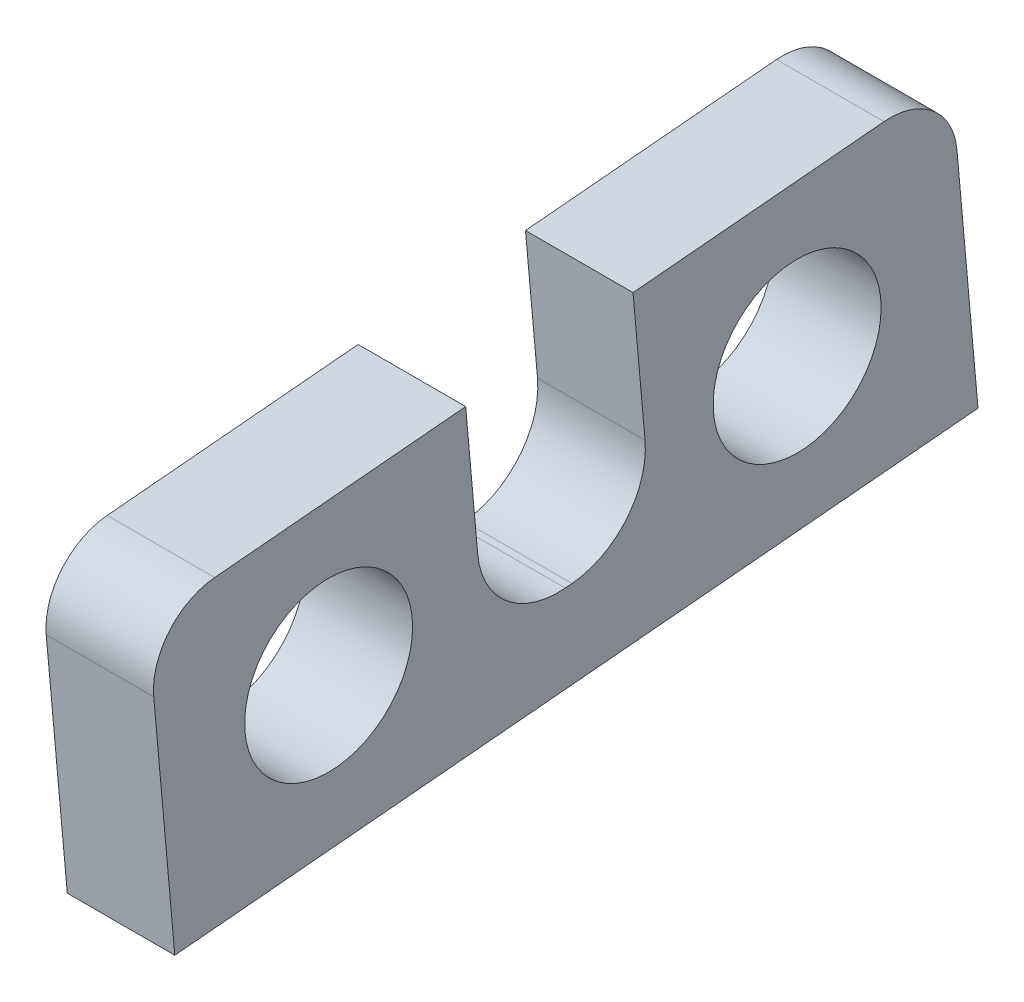
ISO-10303-21;
HEADER;
FILE_DESCRIPTION(('STEP AP214'),'2;1');
FILE_NAME('part.step','',(''),(''),'','','');
FILE_SCHEMA(('AUTOMOTIVE_DESIGN { 1 0 10303 214 1 1 1 1 }'));
ENDSEC;
DATA;
#1=APPLICATION_CONTEXT('core data for automotive mechanical design processes');
#2=APPLICATION_PROTOCOL_DEFINITION('international standard','automotive_design',2000,#1);
#3=PRODUCT_CONTEXT('',#1,'mechanical');
#4=PRODUCT('Part','Part','',(#3));
#5=PRODUCT_RELATED_PRODUCT_CATEGORY('part','',(#4));
#6=PRODUCT_DEFINITION_FORMATION('','',#4);
#7=PRODUCT_DEFINITION_CONTEXT('part definition',#1,'design');
#8=PRODUCT_DEFINITION('design','',#6,#7);
#9=PRODUCT_DEFINITION_SHAPE('','',#8);
#10=(LENGTH_UNIT() NAMED_UNIT(*) SI_UNIT(.MILLI.,.METRE.));
#11=(NAMED_UNIT(*) PLANE_ANGLE_UNIT() SI_UNIT($,.RADIAN.));
#12=(NAMED_UNIT(*) SI_UNIT($,.STERADIAN.) SOLID_ANGLE_UNIT());
#13=UNCERTAINTY_MEASURE_WITH_UNIT(LENGTH_MEASURE(1.E-05),#10,'distance_accuracy_value','');
#14=(GEOMETRIC_REPRESENTATION_CONTEXT(3) GLOBAL_UNCERTAINTY_ASSIGNED_CONTEXT((#13)) GLOBAL_UNIT_ASSIGNED_CONTEXT((#10,
#11,#12)) REPRESENTATION_CONTEXT('',''));
#15=CARTESIAN_POINT('',(0.,0.,0.));
#16=DIRECTION('',(0.,0.,1.));
#17=DIRECTION('',(1.,0.,0.));
#18=AXIS2_PLACEMENT_3D('',#15,#16,#17);
#19=CARTESIAN_POINT('',(1.6,32.7650006035263,-1.71816877408288));
#20=DIRECTION('',(1.,0.,0.));
#21=DIRECTION('',(0.,0.,-1.));
#22=AXIS2_PLACEMENT_3D('',#19,#20,#21);
#23=PLANE('',#22);
#24=CARTESIAN_POINT('',(1.6,30.759584164468,6.63592033879625));
#25=DIRECTION('',(1.,0.,0.));
#26=DIRECTION('',(0.,0.,-1.));
#27=AXIS2_PLACEMENT_3D('',#24,#25,#26);
#28=CIRCLE('',#27,1.25);
#29=CARTESIAN_POINT('',(1.6,30.759584164468,5.38592033879625));
#30=VERTEX_POINT('',#29);
#31=EDGE_CURVE('E174',#30,#30,#28,.T.);
#32=ORIENTED_EDGE('',*,*,#31,.F.);
#33=EDGE_LOOP('',(#32));
#34=FACE_BOUND('',#33,.T.);
#35=CARTESIAN_POINT('',(1.6,32.7650006035263,-1.71816877408288));
#36=DIRECTION('',(1.,0.,0.));
#37=DIRECTION('',(0.,0.,-1.));
#38=AXIS2_PLACEMENT_3D('',#35,#36,#37);
#39=CIRCLE('',#38,1.);
#40=CARTESIAN_POINT('',(1.6,32.854462799508,-2.71415899265439));
#41=VERTEX_POINT('',#40);
#42=CARTESIAN_POINT('',(1.6,33.7609908220978,-1.62870657810113));
#43=VERTEX_POINT('',#42);
#44=EDGE_CURVE('E204',#41,#43,#39,.T.);
#45=ORIENTED_EDGE('',*,*,#44,.T.);
#46=DIRECTION('',(0.,-0.0894621959817451,0.99599021857151));
#47=VECTOR('',#46,1.);
#48=CARTESIAN_POINT('',(1.6,33.4255075871663,2.10625674154203));
#49=LINE('',#48,#47);
#50=CARTESIAN_POINT('',(1.6,33.4255075871663,2.10625674154203));
#51=VERTEX_POINT('',#50);
#52=EDGE_CURVE('E114',#43,#51,#49,.T.);
#53=ORIENTED_EDGE('',*,*,#52,.T.);
#54=DIRECTION('',(0.,-0.99599021857151,-0.0894621959817466));
#55=VECTOR('',#54,1.);
#56=CARTESIAN_POINT('',(1.6,31.4335271500232,1.92733234957854));
#57=LINE('',#56,#55);
#58=CARTESIAN_POINT('',(1.6,31.4335271500232,1.92733234957854));
#59=VERTEX_POINT('',#58);
#60=EDGE_CURVE('E240',#51,#59,#57,.T.);
#61=ORIENTED_EDGE('',*,*,#60,.T.);
#62=CARTESIAN_POINT('',(1.6,31.3261725148451,3.12252061186435));
#63=DIRECTION('',(-1.,0.,0.));
#64=DIRECTION('',(0.,0.,-1.));
#65=AXIS2_PLACEMENT_3D('',#62,#63,#64);
#66=CIRCLE('',#65,1.2);
#67=CARTESIAN_POINT('',(1.6,30.1309842525593,3.01516597668625));
#68=VERTEX_POINT('',#67);
#69=EDGE_CURVE('E260',#59,#68,#66,.T.);
#70=ORIENTED_EDGE('',*,*,#69,.T.);
#71=DIRECTION('',(0.,-0.0894621959817545,0.995990218571509));
#72=VECTOR('',#71,1.);
#73=CARTESIAN_POINT('',(1.6,30.1220380329612,3.11476499854341));
#74=LINE('',#73,#72);
#75=CARTESIAN_POINT('',(1.6,30.1220380329612,3.11476499854341));
#76=VERTEX_POINT('',#75);
#77=EDGE_CURVE('E256',#68,#76,#74,.T.);
#78=ORIENTED_EDGE('',*,*,#77,.T.);
#79=CARTESIAN_POINT('',(1.6,31.317226295247,3.2221196337215));
#80=DIRECTION('',(-1.,0.,0.));
#81=DIRECTION('',(0.,0.,-1.));
#82=AXIS2_PLACEMENT_3D('',#79,#80,#81);
#83=CIRCLE('',#82,1.2);
#84=CARTESIAN_POINT('',(1.6,31.2098716600689,4.41730789600731));
#85=VERTEX_POINT('',#84);
#86=EDGE_CURVE('E259',#76,#85,#83,.T.);
#87=ORIENTED_EDGE('',*,*,#86,.T.);
#88=DIRECTION('',(0.,0.99599021857151,0.0894621959817469));
#89=VECTOR('',#88,1.);
#90=CARTESIAN_POINT('',(1.6,33.2018520972119,4.59623228797081));
#91=LINE('',#90,#89);
#92=CARTESIAN_POINT('',(1.6,33.2018520972119,4.59623228797081));
#93=VERTEX_POINT('',#92);
#94=EDGE_CURVE('E263',#85,#93,#91,.T.);
#95=ORIENTED_EDGE('',*,*,#94,.T.);
#96=DIRECTION('',(0.,-0.0894621959817451,0.99599021857151));
#97=VECTOR('',#96,1.);
#98=CARTESIAN_POINT('',(1.6,32.8663688622804,8.33119560761397));
#99=LINE('',#98,#97);
#100=CARTESIAN_POINT('',(1.6,32.8663688622804,8.33119560761397));
#101=VERTEX_POINT('',#100);
#102=EDGE_CURVE('E270',#93,#101,#99,.T.);
#103=ORIENTED_EDGE('',*,*,#102,.T.);
#104=CARTESIAN_POINT('',(1.6,31.8703786437088,8.24173341163222));
#105=DIRECTION('',(1.,0.,0.));
#106=DIRECTION('',(0.,0.,-1.));
#107=AXIS2_PLACEMENT_3D('',#104,#105,#106);
#108=CIRCLE('',#107,0.999999999999997);
#109=CARTESIAN_POINT('',(1.6,31.7809164477271,9.23772363020373));
#110=VERTEX_POINT('',#109);
#111=EDGE_CURVE('E145',#101,#110,#108,.T.);
#112=ORIENTED_EDGE('',*,*,#111,.T.);
#113=DIRECTION('',(0.,-0.99599021857147,-0.0894621959821926));
#114=VECTOR('',#113,1.);
#115=CARTESIAN_POINT('',(1.6,28.2949506827277,8.92460594426612));
#116=LINE('',#115,#114);
#117=CARTESIAN_POINT('',(1.6,28.2949506827277,8.92460594426612));
#118=VERTEX_POINT('',#117);
#119=EDGE_CURVE('E139',#110,#118,#116,.T.);
#120=ORIENTED_EDGE('',*,*,#119,.T.);
#121=DIRECTION('',(0.,0.0894621959817386,-0.99599021857151));
#122=VECTOR('',#121,1.);
#123=CARTESIAN_POINT('',(1.6,28.2949506827277,8.92460594426612));
#124=LINE('',#123,#122);
#125=CARTESIAN_POINT('',(1.6,29.3684970345086,-3.02727667859201));
#126=VERTEX_POINT('',#125);
#127=EDGE_CURVE('E143',#118,#126,#124,.T.);
#128=ORIENTED_EDGE('',*,*,#127,.T.);
#129=DIRECTION('',(0.,0.995990218571469,0.0894621959821941));
#130=VECTOR('',#129,1.);
#131=CARTESIAN_POINT('',(1.6,32.854462799508,-2.71415899265439));
#132=LINE('',#131,#130);
#133=EDGE_CURVE('E59',#126,#41,#132,.T.);
#134=ORIENTED_EDGE('',*,*,#133,.T.);
#135=EDGE_LOOP('',(#45,#53,#61,#70,#78,#87,#95,#103,#112,#120,#128,#134));
#136=FACE_BOUND('',#135,.T.);
#137=CARTESIAN_POINT('',(1.6,31.3858195363402,-0.33601119120432));
#138=DIRECTION('',(1.,0.,0.));
#139=DIRECTION('',(0.,0.,-1.));
#140=AXIS2_PLACEMENT_3D('',#137,#138,#139);
#141=CIRCLE('',#140,1.25);
#142=CARTESIAN_POINT('',(1.6,31.3858195363402,-1.58601119120432));
#143=VERTEX_POINT('',#142);
#144=EDGE_CURVE('E281',#143,#143,#141,.T.);
#145=ORIENTED_EDGE('',*,*,#144,.F.);
#146=EDGE_LOOP('',(#145));
#147=FACE_BOUND('',#146,.T.);
#148=ADVANCED_FACE('F41',(#34,#136,#147),#23,.T.);
#149=CARTESIAN_POINT('',(0.,32.7650006035263,-1.71816877408288));
#150=DIRECTION('',(1.,0.,0.));
#151=DIRECTION('',(0.,0.,-1.));
#152=AXIS2_PLACEMENT_3D('',#149,#150,#151);
#153=PLANE('',#152);
#154=CARTESIAN_POINT('',(0.,32.7650006035263,-1.71816877408288));
#155=DIRECTION('',(1.,0.,0.));
#156=DIRECTION('',(0.,0.,-1.));
#157=AXIS2_PLACEMENT_3D('',#154,#155,#156);
#158=CIRCLE('',#157,1.);
#159=CARTESIAN_POINT('',(0.,32.854462799508,-2.71415899265439));
#160=VERTEX_POINT('',#159);
#161=CARTESIAN_POINT('',(0.,33.7609908220978,-1.62870657810113));
#162=VERTEX_POINT('',#161);
#163=EDGE_CURVE('E169',#160,#162,#158,.T.);
#164=ORIENTED_EDGE('',*,*,#163,.F.);
#165=DIRECTION('',(0.,0.995990218571469,0.0894621959821941));
#166=VECTOR('',#165,1.);
#167=CARTESIAN_POINT('',(0.,32.854462799508,-2.71415899265439));
#168=LINE('',#167,#166);
#169=CARTESIAN_POINT('',(0.,29.3684970345086,-3.02727667859201));
#170=VERTEX_POINT('',#169);
#171=EDGE_CURVE('E106',#170,#160,#168,.T.);
#172=ORIENTED_EDGE('',*,*,#171,.F.);
#173=DIRECTION('',(0.,0.0894621959817386,-0.99599021857151));
#174=VECTOR('',#173,1.);
#175=CARTESIAN_POINT('',(0.,28.2949506827277,8.92460594426612));
#176=LINE('',#175,#174);
#177=CARTESIAN_POINT('',(0.,28.2949506827277,8.92460594426612));
#178=VERTEX_POINT('',#177);
#179=EDGE_CURVE('E100',#178,#170,#176,.T.);
#180=ORIENTED_EDGE('',*,*,#179,.F.);
#181=DIRECTION('',(0.,-0.99599021857147,-0.0894621959821926));
#182=VECTOR('',#181,1.);
#183=CARTESIAN_POINT('',(0.,28.2949506827277,8.92460594426612));
#184=LINE('',#183,#182);
#185=CARTESIAN_POINT('',(0.,31.7809164477271,9.23772363020373));
#186=VERTEX_POINT('',#185);
#187=EDGE_CURVE('E154',#186,#178,#184,.T.);
#188=ORIENTED_EDGE('',*,*,#187,.F.);
#189=CARTESIAN_POINT('',(0.,31.8703786437088,8.24173341163222));
#190=DIRECTION('',(1.,0.,0.));
#191=DIRECTION('',(0.,0.,-1.));
#192=AXIS2_PLACEMENT_3D('',#189,#190,#191);
#193=CIRCLE('',#192,0.999999999999997);
#194=CARTESIAN_POINT('',(0.,32.8663688622804,8.33119560761397));
#195=VERTEX_POINT('',#194);
#196=EDGE_CURVE('E195',#195,#186,#193,.T.);
#197=ORIENTED_EDGE('',*,*,#196,.F.);
#198=DIRECTION('',(0.,-0.0894621959817451,0.99599021857151));
#199=VECTOR('',#198,1.);
#200=CARTESIAN_POINT('',(0.,32.8663688622804,8.33119560761397));
#201=LINE('',#200,#199);
#202=CARTESIAN_POINT('',(0.,33.2018520972119,4.59623228797081));
#203=VERTEX_POINT('',#202);
#204=EDGE_CURVE('E192',#203,#195,#201,.T.);
#205=ORIENTED_EDGE('',*,*,#204,.F.);
#206=DIRECTION('',(0.,0.99599021857151,0.0894621959817469));
#207=VECTOR('',#206,1.);
#208=CARTESIAN_POINT('',(0.,33.2018520972119,4.59623228797081));
#209=LINE('',#208,#207);
#210=CARTESIAN_POINT('',(0.,31.2098716600689,4.41730789600731));
#211=VERTEX_POINT('',#210);
#212=EDGE_CURVE('E189',#211,#203,#209,.T.);
#213=ORIENTED_EDGE('',*,*,#212,.F.);
#214=CARTESIAN_POINT('',(0.,31.317226295247,3.2221196337215));
#215=DIRECTION('',(-1.,0.,0.));
#216=DIRECTION('',(0.,0.,-1.));
#217=AXIS2_PLACEMENT_3D('',#214,#215,#216);
#218=CIRCLE('',#217,1.2);
#219=CARTESIAN_POINT('',(0.,30.1220380329612,3.11476499854341));
#220=VERTEX_POINT('',#219);
#221=EDGE_CURVE('E186',#220,#211,#218,.T.);
#222=ORIENTED_EDGE('',*,*,#221,.F.);
#223=DIRECTION('',(0.,-0.0894621959817545,0.995990218571509));
#224=VECTOR('',#223,1.);
#225=CARTESIAN_POINT('',(0.,30.1220380329612,3.11476499854341));
#226=LINE('',#225,#224);
#227=CARTESIAN_POINT('',(0.,30.1309842525593,3.01516597668625));
#228=VERTEX_POINT('',#227);
#229=EDGE_CURVE('E183',#228,#220,#226,.T.);
#230=ORIENTED_EDGE('',*,*,#229,.F.);
#231=CARTESIAN_POINT('',(0.,31.3261725148451,3.12252061186435));
#232=DIRECTION('',(-1.,0.,0.));
#233=DIRECTION('',(0.,0.,-1.));
#234=AXIS2_PLACEMENT_3D('',#231,#232,#233);
#235=CIRCLE('',#234,1.2);
#236=CARTESIAN_POINT('',(0.,31.4335271500232,1.92733234957854));
#237=VERTEX_POINT('',#236);
#238=EDGE_CURVE('E180',#237,#228,#235,.T.);
#239=ORIENTED_EDGE('',*,*,#238,.F.);
#240=DIRECTION('',(0.,-0.99599021857151,-0.0894621959817466));
#241=VECTOR('',#240,1.);
#242=CARTESIAN_POINT('',(0.,31.4335271500232,1.92733234957854));
#243=LINE('',#242,#241);
#244=CARTESIAN_POINT('',(0.,33.4255075871663,2.10625674154203));
#245=VERTEX_POINT('',#244);
#246=EDGE_CURVE('E177',#245,#237,#243,.T.);
#247=ORIENTED_EDGE('',*,*,#246,.F.);
#248=DIRECTION('',(0.,-0.0894621959817451,0.99599021857151));
#249=VECTOR('',#248,1.);
#250=CARTESIAN_POINT('',(0.,33.4255075871663,2.10625674154203));
#251=LINE('',#250,#249);
#252=EDGE_CURVE('E173',#162,#245,#251,.T.);
#253=ORIENTED_EDGE('',*,*,#252,.F.);
#254=EDGE_LOOP('',(#164,#172,#180,#188,#197,#205,#213,#222,#230,#239,#247,#253));
#255=FACE_BOUND('',#254,.T.);
#256=CARTESIAN_POINT('',(0.,30.759584164468,6.63592033879625));
#257=DIRECTION('',(1.,0.,0.));
#258=DIRECTION('',(0.,0.,-1.));
#259=AXIS2_PLACEMENT_3D('',#256,#257,#258);
#260=CIRCLE('',#259,1.25);
#261=CARTESIAN_POINT('',(0.,30.759584164468,5.38592033879625));
#262=VERTEX_POINT('',#261);
#263=EDGE_CURVE('E275',#262,#262,#260,.T.);
#264=ORIENTED_EDGE('',*,*,#263,.T.);
#265=EDGE_LOOP('',(#264));
#266=FACE_BOUND('',#265,.T.);
#267=CARTESIAN_POINT('',(0.,31.3858195363402,-0.33601119120432));
#268=DIRECTION('',(1.,0.,0.));
#269=DIRECTION('',(0.,0.,-1.));
#270=AXIS2_PLACEMENT_3D('',#267,#268,#269);
#271=CIRCLE('',#270,1.25);
#272=CARTESIAN_POINT('',(0.,31.3858195363402,-1.58601119120432));
#273=VERTEX_POINT('',#272);
#274=EDGE_CURVE('E284',#273,#273,#271,.T.);
#275=ORIENTED_EDGE('',*,*,#274,.T.);
#276=EDGE_LOOP('',(#275));
#277=FACE_BOUND('',#276,.T.);
#278=ADVANCED_FACE('F244',(#255,#266,#277),#153,.F.);
#279=CARTESIAN_POINT('',(1.6,32.7650006035263,-1.71816877408288));
#280=DIRECTION('',(-1.,0.,0.));
#281=DIRECTION('',(0.,0.,1.));
#282=AXIS2_PLACEMENT_3D('',#279,#280,#281);
#283=CYLINDRICAL_SURFACE('',#282,1.);
#284=ORIENTED_EDGE('',*,*,#163,.T.);
#285=DIRECTION('',(-1.,0.,0.));
#286=VECTOR('',#285,1.);
#287=CARTESIAN_POINT('',(1.6,33.7609908220978,-1.62870657810113));
#288=LINE('',#287,#286);
#289=EDGE_CURVE('E11',#43,#162,#288,.T.);
#290=ORIENTED_EDGE('',*,*,#289,.F.);
#291=ORIENTED_EDGE('',*,*,#44,.F.);
#292=DIRECTION('',(-1.,0.,0.));
#293=VECTOR('',#292,1.);
#294=CARTESIAN_POINT('',(1.6,32.854462799508,-2.71415899265439));
#295=LINE('',#294,#293);
#296=EDGE_CURVE('E165',#41,#160,#295,.T.);
#297=ORIENTED_EDGE('',*,*,#296,.T.);
#298=EDGE_LOOP('',(#284,#290,#291,#297));
#299=FACE_BOUND('',#298,.T.);
#300=ADVANCED_FACE('F43',(#299),#283,.T.);
#301=CARTESIAN_POINT('',(1.6,33.4255075871663,2.10625674154203));
#302=DIRECTION('',(0.,-0.99599021857151,-0.0894621959817451));
#303=DIRECTION('',(0.,0.0894621959817451,-0.99599021857151));
#304=AXIS2_PLACEMENT_3D('',#301,#302,#303);
#305=PLANE('',#304);
#306=ORIENTED_EDGE('',*,*,#252,.T.);
#307=DIRECTION('',(-1.,0.,0.));
#308=VECTOR('',#307,1.);
#309=CARTESIAN_POINT('',(1.6,33.4255075871663,2.10625674154203));
#310=LINE('',#309,#308);
#311=EDGE_CURVE('E51',#51,#245,#310,.T.);
#312=ORIENTED_EDGE('',*,*,#311,.F.);
#313=ORIENTED_EDGE('',*,*,#52,.F.);
#314=ORIENTED_EDGE('',*,*,#289,.T.);
#315=EDGE_LOOP('',(#306,#312,#313,#314));
#316=FACE_BOUND('',#315,.T.);
#317=ADVANCED_FACE('F294',(#316),#305,.F.);
#318=CARTESIAN_POINT('',(1.6,31.4335271500232,1.92733234957854));
#319=DIRECTION('',(0.,0.0894621959817466,-0.99599021857151));
#320=DIRECTION('',(0.,0.99599021857151,0.0894621959817466));
#321=AXIS2_PLACEMENT_3D('',#318,#319,#320);
#322=PLANE('',#321);
#323=ORIENTED_EDGE('',*,*,#246,.T.);
#324=DIRECTION('',(-1.,0.,0.));
#325=VECTOR('',#324,1.);
#326=CARTESIAN_POINT('',(1.6,31.4335271500232,1.92733234957854));
#327=LINE('',#326,#325);
#328=EDGE_CURVE('E230',#59,#237,#327,.T.);
#329=ORIENTED_EDGE('',*,*,#328,.F.);
#330=ORIENTED_EDGE('',*,*,#60,.F.);
#331=ORIENTED_EDGE('',*,*,#311,.T.);
#332=EDGE_LOOP('',(#323,#329,#330,#331));
#333=FACE_BOUND('',#332,.T.);
#334=ADVANCED_FACE('F238',(#333),#322,.F.);
#335=CARTESIAN_POINT('',(1.6,31.3261725148451,3.12252061186435));
#336=DIRECTION('',(-1.,0.,0.));
#337=DIRECTION('',(0.,0.,1.));
#338=AXIS2_PLACEMENT_3D('',#335,#336,#337);
#339=CYLINDRICAL_SURFACE('',#338,1.2);
#340=ORIENTED_EDGE('',*,*,#238,.T.);
#341=DIRECTION('',(-1.,0.,0.));
#342=VECTOR('',#341,1.);
#343=CARTESIAN_POINT('',(1.6,30.1309842525593,3.01516597668625));
#344=LINE('',#343,#342);
#345=EDGE_CURVE('E226',#68,#228,#344,.T.);
#346=ORIENTED_EDGE('',*,*,#345,.F.);
#347=ORIENTED_EDGE('',*,*,#69,.F.);
#348=ORIENTED_EDGE('',*,*,#328,.T.);
#349=EDGE_LOOP('',(#340,#346,#347,#348));
#350=FACE_BOUND('',#349,.T.);
#351=ADVANCED_FACE('F250',(#350),#339,.F.);
#352=CARTESIAN_POINT('',(1.6,30.1220380329612,3.11476499854341));
#353=DIRECTION('',(0.,-0.995990218571509,-0.0894621959817545));
#354=DIRECTION('',(0.,0.0894621959817545,-0.995990218571509));
#355=AXIS2_PLACEMENT_3D('',#352,#353,#354);
#356=PLANE('',#355);
#357=ORIENTED_EDGE('',*,*,#229,.T.);
#358=DIRECTION('',(-1.,0.,0.));
#359=VECTOR('',#358,1.);
#360=CARTESIAN_POINT('',(1.6,30.1220380329612,3.11476499854341));
#361=LINE('',#360,#359);
#362=EDGE_CURVE('E222',#76,#220,#361,.T.);
#363=ORIENTED_EDGE('',*,*,#362,.F.);
#364=ORIENTED_EDGE('',*,*,#77,.F.);
#365=ORIENTED_EDGE('',*,*,#345,.T.);
#366=EDGE_LOOP('',(#357,#363,#364,#365));
#367=FACE_BOUND('',#366,.T.);
#368=ADVANCED_FACE('F254',(#367),#356,.F.);
#369=CARTESIAN_POINT('',(1.6,31.317226295247,3.2221196337215));
#370=DIRECTION('',(-1.,0.,0.));
#371=DIRECTION('',(0.,0.,1.));
#372=AXIS2_PLACEMENT_3D('',#369,#370,#371);
#373=CYLINDRICAL_SURFACE('',#372,1.2);
#374=ORIENTED_EDGE('',*,*,#221,.T.);
#375=DIRECTION('',(-1.,0.,0.));
#376=VECTOR('',#375,1.);
#377=CARTESIAN_POINT('',(1.6,31.2098716600689,4.41730789600731));
#378=LINE('',#377,#376);
#379=EDGE_CURVE('E218',#85,#211,#378,.T.);
#380=ORIENTED_EDGE('',*,*,#379,.F.);
#381=ORIENTED_EDGE('',*,*,#86,.F.);
#382=ORIENTED_EDGE('',*,*,#362,.T.);
#383=EDGE_LOOP('',(#374,#380,#381,#382));
#384=FACE_BOUND('',#383,.T.);
#385=ADVANCED_FACE('F330',(#384),#373,.F.);
#386=CARTESIAN_POINT('',(1.6,33.2018520972119,4.59623228797081));
#387=DIRECTION('',(0.,-0.0894621959817469,0.99599021857151));
#388=DIRECTION('',(0.,-0.99599021857151,-0.0894621959817469));
#389=AXIS2_PLACEMENT_3D('',#386,#387,#388);
#390=PLANE('',#389);
#391=ORIENTED_EDGE('',*,*,#212,.T.);
#392=DIRECTION('',(-1.,0.,0.));
#393=VECTOR('',#392,1.);
#394=CARTESIAN_POINT('',(1.6,33.2018520972119,4.59623228797081));
#395=LINE('',#394,#393);
#396=EDGE_CURVE('E215',#93,#203,#395,.T.);
#397=ORIENTED_EDGE('',*,*,#396,.F.);
#398=ORIENTED_EDGE('',*,*,#94,.F.);
#399=ORIENTED_EDGE('',*,*,#379,.T.);
#400=EDGE_LOOP('',(#391,#397,#398,#399));
#401=FACE_BOUND('',#400,.T.);
#402=ADVANCED_FACE('F326',(#401),#390,.F.);
#403=CARTESIAN_POINT('',(1.6,32.8663688622804,8.33119560761397));
#404=DIRECTION('',(0.,-0.99599021857151,-0.0894621959817451));
#405=DIRECTION('',(0.,0.0894621959817451,-0.99599021857151));
#406=AXIS2_PLACEMENT_3D('',#403,#404,#405);
#407=PLANE('',#406);
#408=ORIENTED_EDGE('',*,*,#204,.T.);
#409=DIRECTION('',(-1.,0.,0.));
#410=VECTOR('',#409,1.);
#411=CARTESIAN_POINT('',(1.6,32.8663688622804,8.33119560761397));
#412=LINE('',#411,#410);
#413=EDGE_CURVE('E211',#101,#195,#412,.T.);
#414=ORIENTED_EDGE('',*,*,#413,.F.);
#415=ORIENTED_EDGE('',*,*,#102,.F.);
#416=ORIENTED_EDGE('',*,*,#396,.T.);
#417=EDGE_LOOP('',(#408,#414,#415,#416));
#418=FACE_BOUND('',#417,.T.);
#419=ADVANCED_FACE('F322',(#418),#407,.F.);
#420=CARTESIAN_POINT('',(1.6,31.8703786437088,8.24173341163222));
#421=DIRECTION('',(-1.,0.,0.));
#422=DIRECTION('',(0.,0.,1.));
#423=AXIS2_PLACEMENT_3D('',#420,#421,#422);
#424=CYLINDRICAL_SURFACE('',#423,0.999999999999997);
#425=ORIENTED_EDGE('',*,*,#196,.T.);
#426=DIRECTION('',(-1.,0.,0.));
#427=VECTOR('',#426,1.);
#428=CARTESIAN_POINT('',(1.6,31.7809164477271,9.23772363020373));
#429=LINE('',#428,#427);
#430=EDGE_CURVE('E156',#110,#186,#429,.T.);
#431=ORIENTED_EDGE('',*,*,#430,.F.);
#432=ORIENTED_EDGE('',*,*,#111,.F.);
#433=ORIENTED_EDGE('',*,*,#413,.T.);
#434=EDGE_LOOP('',(#425,#431,#432,#433));
#435=FACE_BOUND('',#434,.T.);
#436=ADVANCED_FACE('F319',(#435),#424,.T.);
#437=CARTESIAN_POINT('',(1.6,28.2949506827277,8.92460594426612));
#438=DIRECTION('',(0.,0.0894621959821926,-0.99599021857147));
#439=DIRECTION('',(0.,0.99599021857147,0.0894621959821926));
#440=AXIS2_PLACEMENT_3D('',#437,#438,#439);
#441=PLANE('',#440);
#442=ORIENTED_EDGE('',*,*,#187,.T.);
#443=DIRECTION('',(-1.,0.,0.));
#444=VECTOR('',#443,1.);
#445=CARTESIAN_POINT('',(1.6,28.2949506827277,8.92460594426612));
#446=LINE('',#445,#444);
#447=EDGE_CURVE('E151',#118,#178,#446,.T.);
#448=ORIENTED_EDGE('',*,*,#447,.F.);
#449=ORIENTED_EDGE('',*,*,#119,.F.);
#450=ORIENTED_EDGE('',*,*,#430,.T.);
#451=EDGE_LOOP('',(#442,#448,#449,#450));
#452=FACE_BOUND('',#451,.T.);
#453=ADVANCED_FACE('F152',(#452),#441,.F.);
#454=CARTESIAN_POINT('',(1.6,28.2949506827277,8.92460594426612));
#455=DIRECTION('',(0.,0.99599021857151,0.0894621959817386));
#456=DIRECTION('',(0.,-0.0894621959817386,0.99599021857151));
#457=AXIS2_PLACEMENT_3D('',#454,#455,#456);
#458=PLANE('',#457);
#459=ORIENTED_EDGE('',*,*,#179,.T.);
#460=DIRECTION('',(-1.,0.,0.));
#461=VECTOR('',#460,1.);
#462=CARTESIAN_POINT('',(1.6,29.3684970345086,-3.02727667859201));
#463=LINE('',#462,#461);
#464=EDGE_CURVE('E157',#126,#170,#463,.T.);
#465=ORIENTED_EDGE('',*,*,#464,.F.);
#466=ORIENTED_EDGE('',*,*,#127,.F.);
#467=ORIENTED_EDGE('',*,*,#447,.T.);
#468=EDGE_LOOP('',(#459,#465,#466,#467));
#469=FACE_BOUND('',#468,.T.);
#470=ADVANCED_FACE('F159',(#469),#458,.F.);
#471=CARTESIAN_POINT('',(1.6,32.854462799508,-2.71415899265439));
#472=DIRECTION('',(0.,-0.0894621959821941,0.995990218571469));
#473=DIRECTION('',(0.,-0.99599021857147,-0.0894621959821941));
#474=AXIS2_PLACEMENT_3D('',#471,#472,#473);
#475=PLANE('',#474);
#476=ORIENTED_EDGE('',*,*,#171,.T.);
#477=ORIENTED_EDGE('',*,*,#296,.F.);
#478=ORIENTED_EDGE('',*,*,#133,.F.);
#479=ORIENTED_EDGE('',*,*,#464,.T.);
#480=EDGE_LOOP('',(#476,#477,#478,#479));
#481=FACE_BOUND('',#480,.T.);
#482=ADVANCED_FACE('F312',(#481),#475,.F.);
#483=CARTESIAN_POINT('',(1.6,30.759584164468,6.63592033879625));
#484=DIRECTION('',(-1.,0.,0.));
#485=DIRECTION('',(0.,0.,1.));
#486=AXIS2_PLACEMENT_3D('',#483,#484,#485);
#487=CYLINDRICAL_SURFACE('',#486,1.25);
#488=ORIENTED_EDGE('',*,*,#31,.T.);
#489=EDGE_LOOP('',(#488));
#490=FACE_BOUND('',#489,.T.);
#491=ORIENTED_EDGE('',*,*,#263,.F.);
#492=EDGE_LOOP('',(#491));
#493=FACE_BOUND('',#492,.T.);
#494=ADVANCED_FACE('F309',(#490,#493),#487,.F.);
#495=CARTESIAN_POINT('',(1.6,31.3858195363402,-0.33601119120432));
#496=DIRECTION('',(-1.,0.,0.));
#497=DIRECTION('',(0.,0.,1.));
#498=AXIS2_PLACEMENT_3D('',#495,#496,#497);
#499=CYLINDRICAL_SURFACE('',#498,1.25);
#500=ORIENTED_EDGE('',*,*,#144,.T.);
#501=EDGE_LOOP('',(#500));
#502=FACE_BOUND('',#501,.T.);
#503=ORIENTED_EDGE('',*,*,#274,.F.);
#504=EDGE_LOOP('',(#503));
#505=FACE_BOUND('',#504,.T.);
#506=ADVANCED_FACE('F371',(#502,#505),#499,.F.);
#507=CLOSED_SHELL('',(#148,#278,#300,#317,#334,#351,#368,#385,#402,#419,#436,#453,#470,#482,
#494,#506));
#508=MANIFOLD_SOLID_BREP('B2',#507);
#509=ADVANCED_BREP_SHAPE_REPRESENTATION('',(#18,#508),#14);
#510=SHAPE_DEFINITION_REPRESENTATION(#9,#509);
ENDSEC;
END-ISO-10303-21;
